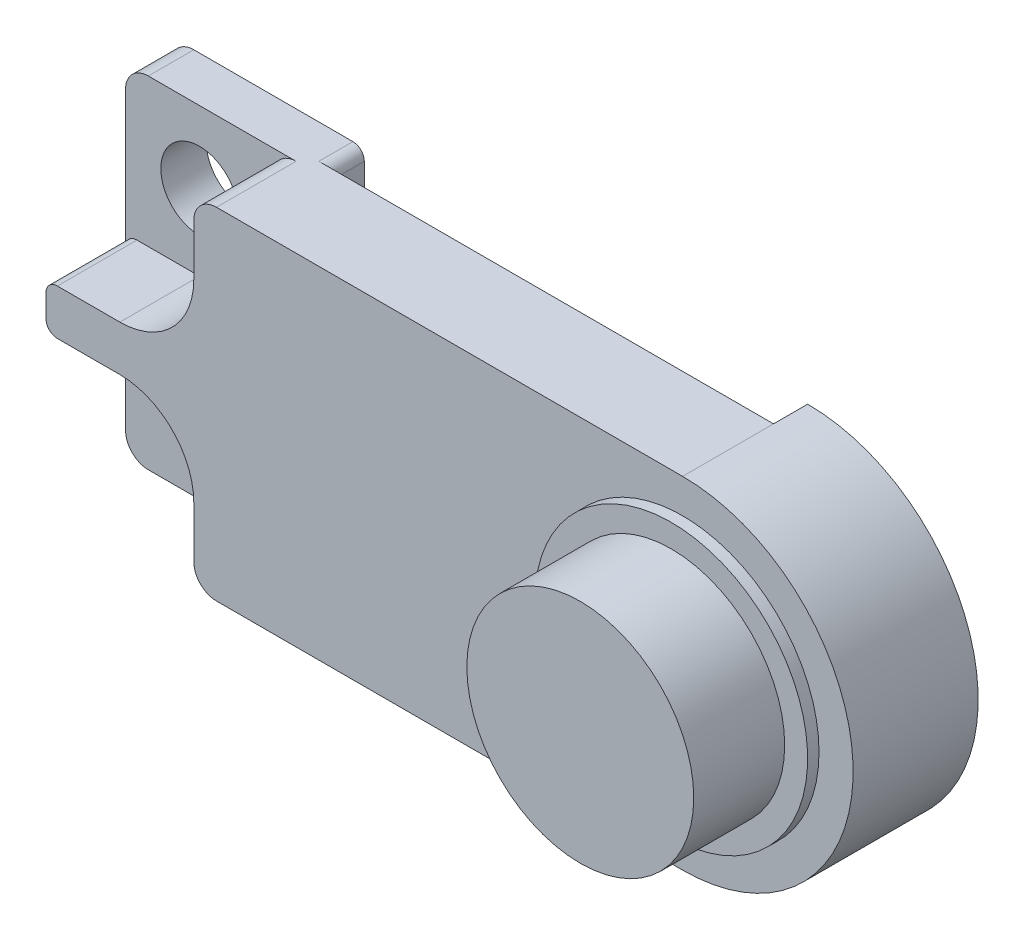
ISO-10303-21;
HEADER;
FILE_DESCRIPTION(('STEP AP214'),'2;1');
FILE_NAME('part.step','',(''),(''),'','','');
FILE_SCHEMA(('AUTOMOTIVE_DESIGN { 1 0 10303 214 1 1 1 1 }'));
ENDSEC;
DATA;
#1=APPLICATION_CONTEXT('core data for automotive mechanical design processes');
#2=APPLICATION_PROTOCOL_DEFINITION('international standard','automotive_design',2000,#1);
#3=PRODUCT_CONTEXT('',#1,'mechanical');
#4=PRODUCT('Part','Part','',(#3));
#5=PRODUCT_RELATED_PRODUCT_CATEGORY('part','',(#4));
#6=PRODUCT_DEFINITION_FORMATION('','',#4);
#7=PRODUCT_DEFINITION_CONTEXT('part definition',#1,'design');
#8=PRODUCT_DEFINITION('design','',#6,#7);
#9=PRODUCT_DEFINITION_SHAPE('','',#8);
#10=(LENGTH_UNIT() NAMED_UNIT(*) SI_UNIT(.MILLI.,.METRE.));
#11=(NAMED_UNIT(*) PLANE_ANGLE_UNIT() SI_UNIT($,.RADIAN.));
#12=(NAMED_UNIT(*) SI_UNIT($,.STERADIAN.) SOLID_ANGLE_UNIT());
#13=UNCERTAINTY_MEASURE_WITH_UNIT(LENGTH_MEASURE(1.E-05),#10,'distance_accuracy_value','');
#14=(GEOMETRIC_REPRESENTATION_CONTEXT(3) GLOBAL_UNCERTAINTY_ASSIGNED_CONTEXT((#13)) GLOBAL_UNIT_ASSIGNED_CONTEXT((#10,
#11,#12)) REPRESENTATION_CONTEXT('',''));
#15=CARTESIAN_POINT('',(0.,0.,0.));
#16=DIRECTION('',(0.,0.,1.));
#17=DIRECTION('',(1.,0.,0.));
#18=AXIS2_PLACEMENT_3D('',#15,#16,#17);
#19=CARTESIAN_POINT('',(19.5,-1.83387272193696,0.));
#20=DIRECTION('',(0.,0.,1.));
#21=DIRECTION('',(1.,0.,0.));
#22=AXIS2_PLACEMENT_3D('',#19,#20,#21);
#23=PLANE('',#22);
#24=CARTESIAN_POINT('',(19.5,-1.83387272193696,0.));
#25=DIRECTION('',(0.,0.,1.));
#26=DIRECTION('',(1.,0.,0.));
#27=AXIS2_PLACEMENT_3D('',#24,#25,#26);
#28=CIRCLE('',#27,7.50000000000001);
#29=CARTESIAN_POINT('',(19.5,-9.33387272193696,0.));
#30=VERTEX_POINT('',#29);
#31=CARTESIAN_POINT('',(19.5,5.66612727806305,0.));
#32=VERTEX_POINT('',#31);
#33=EDGE_CURVE('E231',#30,#32,#28,.T.);
#34=ORIENTED_EDGE('',*,*,#33,.F.);
#35=DIRECTION('',(0.,-1.,0.));
#36=VECTOR('',#35,1.);
#37=CARTESIAN_POINT('',(19.5,5.66612727806305,0.));
#38=LINE('',#37,#36);
#39=EDGE_CURVE('E366',#32,#30,#38,.T.);
#40=ORIENTED_EDGE('',*,*,#39,.F.);
#41=EDGE_LOOP('',(#34,#40));
#42=FACE_BOUND('',#41,.T.);
#43=ADVANCED_FACE('F41',(#42),#23,.F.);
#44=CARTESIAN_POINT('',(19.5,-1.83387272193696,0.));
#45=DIRECTION('',(0.,0.,1.));
#46=DIRECTION('',(1.,0.,0.));
#47=AXIS2_PLACEMENT_3D('',#44,#45,#46);
#48=CYLINDRICAL_SURFACE('',#47,7.50000000000001);
#49=CARTESIAN_POINT('',(19.5,-1.83387272193696,5.5));
#50=DIRECTION('',(0.,0.,1.));
#51=DIRECTION('',(1.,0.,0.));
#52=AXIS2_PLACEMENT_3D('',#49,#50,#51);
#53=CIRCLE('',#52,7.50000000000001);
#54=CARTESIAN_POINT('',(19.5,-9.33387272193696,5.5));
#55=VERTEX_POINT('',#54);
#56=CARTESIAN_POINT('',(19.5,5.66612727806305,5.5));
#57=VERTEX_POINT('',#56);
#58=EDGE_CURVE('E368',#55,#57,#53,.T.);
#59=ORIENTED_EDGE('',*,*,#58,.F.);
#60=DIRECTION('',(0.,0.,1.));
#61=VECTOR('',#60,1.);
#62=CARTESIAN_POINT('',(19.5,-9.33387272193696,0.));
#63=LINE('',#62,#61);
#64=CARTESIAN_POINT('',(19.5,-9.33387272193696,1.5));
#65=VERTEX_POINT('',#64);
#66=EDGE_CURVE('E232',#65,#55,#63,.T.);
#67=ORIENTED_EDGE('',*,*,#66,.F.);
#68=EDGE_CURVE('E201',#30,#65,#63,.T.);
#69=ORIENTED_EDGE('',*,*,#68,.F.);
#70=ORIENTED_EDGE('',*,*,#33,.T.);
#71=DIRECTION('',(0.,0.,1.));
#72=VECTOR('',#71,1.);
#73=CARTESIAN_POINT('',(19.5,5.66612727806305,0.));
#74=LINE('',#73,#72);
#75=CARTESIAN_POINT('',(19.5,5.66612727806305,1.5));
#76=VERTEX_POINT('',#75);
#77=EDGE_CURVE('E198',#32,#76,#74,.T.);
#78=ORIENTED_EDGE('',*,*,#77,.T.);
#79=EDGE_CURVE('E219',#76,#57,#74,.T.);
#80=ORIENTED_EDGE('',*,*,#79,.T.);
#81=EDGE_LOOP('',(#59,#67,#69,#70,#78,#80));
#82=FACE_BOUND('',#81,.T.);
#83=ADVANCED_FACE('F229',(#82),#48,.T.);
#84=CARTESIAN_POINT('',(-8.5,-9.33387272193696,0.));
#85=DIRECTION('',(0.,-1.,0.));
#86=DIRECTION('',(0.,0.,-1.));
#87=AXIS2_PLACEMENT_3D('',#84,#85,#86);
#88=PLANE('',#87);
#89=DIRECTION('',(-1.,0.,0.));
#90=VECTOR('',#89,1.);
#91=CARTESIAN_POINT('',(-2.,-9.33387272193696,2.));
#92=LINE('',#91,#90);
#93=CARTESIAN_POINT('',(-1.,-9.33387272193696,2.));
#94=VERTEX_POINT('',#93);
#95=CARTESIAN_POINT('',(-7.5,-9.33387272193696,2.));
#96=VERTEX_POINT('',#95);
#97=EDGE_CURVE('E447',#94,#96,#92,.T.);
#98=ORIENTED_EDGE('',*,*,#97,.T.);
#99=DIRECTION('',(0.,0.,1.));
#100=VECTOR('',#99,1.);
#101=CARTESIAN_POINT('',(-7.5,-9.33387272193696,0.));
#102=LINE('',#101,#100);
#103=CARTESIAN_POINT('',(-7.5,-9.33387272193696,0.));
#104=VERTEX_POINT('',#103);
#105=EDGE_CURVE('E290',#96,#104,#102,.F.);
#106=ORIENTED_EDGE('',*,*,#105,.T.);
#107=DIRECTION('',(1.,0.,0.));
#108=VECTOR('',#107,1.);
#109=CARTESIAN_POINT('',(-8.5,-9.33387272193696,0.));
#110=LINE('',#109,#108);
#111=CARTESIAN_POINT('',(-0.499999999999999,-9.33387272193696,0.));
#112=VERTEX_POINT('',#111);
#113=EDGE_CURVE('E226',#104,#112,#110,.T.);
#114=ORIENTED_EDGE('',*,*,#113,.T.);
#115=DIRECTION('',(0.,0.,-1.));
#116=VECTOR('',#115,1.);
#117=CARTESIAN_POINT('',(-0.499999999999999,-9.33387272193696,1.5));
#118=LINE('',#117,#116);
#119=CARTESIAN_POINT('',(-0.499999999999997,-9.33387272193696,1.5));
#120=VERTEX_POINT('',#119);
#121=EDGE_CURVE('E268',#112,#120,#118,.F.);
#122=ORIENTED_EDGE('',*,*,#121,.T.);
#123=DIRECTION('',(-1.,0.,0.));
#124=VECTOR('',#123,1.);
#125=CARTESIAN_POINT('',(19.5,-9.33387272193696,1.5));
#126=LINE('',#125,#124);
#127=EDGE_CURVE('E216',#65,#120,#126,.T.);
#128=ORIENTED_EDGE('',*,*,#127,.F.);
#129=ORIENTED_EDGE('',*,*,#66,.T.);
#130=DIRECTION('',(1.,0.,0.));
#131=VECTOR('',#130,1.);
#132=CARTESIAN_POINT('',(-8.5,-9.33387272193696,5.5));
#133=LINE('',#132,#131);
#134=CARTESIAN_POINT('',(-0.999999999999999,-9.33387272193696,5.5));
#135=VERTEX_POINT('',#134);
#136=EDGE_CURVE('E376',#135,#55,#133,.T.);
#137=ORIENTED_EDGE('',*,*,#136,.F.);
#138=DIRECTION('',(0.,0.,1.));
#139=VECTOR('',#138,1.);
#140=CARTESIAN_POINT('',(-0.999999999999999,-9.33387272193696,0.));
#141=LINE('',#140,#139);
#142=EDGE_CURVE('E287',#135,#94,#141,.F.);
#143=ORIENTED_EDGE('',*,*,#142,.T.);
#144=EDGE_LOOP('',(#98,#106,#114,#122,#128,#129,#137,#143));
#145=FACE_BOUND('',#144,.T.);
#146=ADVANCED_FACE('F393',(#145),#88,.T.);
#147=CARTESIAN_POINT('',(-8.5,5.66612727806304,0.));
#148=DIRECTION('',(-1.,0.,0.));
#149=DIRECTION('',(0.,-1.,0.));
#150=AXIS2_PLACEMENT_3D('',#147,#148,#149);
#151=PLANE('',#150);
#152=DIRECTION('',(0.,-1.,0.));
#153=VECTOR('',#152,1.);
#154=CARTESIAN_POINT('',(-8.5,5.66612727806304,0.));
#155=LINE('',#154,#153);
#156=CARTESIAN_POINT('',(-8.5,4.66612727806304,0.));
#157=VERTEX_POINT('',#156);
#158=CARTESIAN_POINT('',(-8.5,-8.33387272193696,0.));
#159=VERTEX_POINT('',#158);
#160=EDGE_CURVE('E379',#157,#159,#155,.T.);
#161=ORIENTED_EDGE('',*,*,#160,.T.);
#162=DIRECTION('',(0.,0.,1.));
#163=VECTOR('',#162,1.);
#164=CARTESIAN_POINT('',(-8.5,-8.33387272193696,0.));
#165=LINE('',#164,#163);
#166=CARTESIAN_POINT('',(-8.5,-8.33387272193696,2.));
#167=VERTEX_POINT('',#166);
#168=EDGE_CURVE('E282',#159,#167,#165,.T.);
#169=ORIENTED_EDGE('',*,*,#168,.T.);
#170=DIRECTION('',(0.,-1.,0.));
#171=VECTOR('',#170,1.);
#172=CARTESIAN_POINT('',(-8.5,-2.83387272193696,2.));
#173=LINE('',#172,#171);
#174=CARTESIAN_POINT('',(-8.5,-2.33387272193696,2.));
#175=VERTEX_POINT('',#174);
#176=EDGE_CURVE('E432',#175,#167,#173,.T.);
#177=ORIENTED_EDGE('',*,*,#176,.F.);
#178=DIRECTION('',(0.,0.,-1.));
#179=VECTOR('',#178,1.);
#180=CARTESIAN_POINT('',(-8.5,-2.33387272193696,5.5));
#181=LINE('',#180,#179);
#182=CARTESIAN_POINT('',(-8.5,-2.33387272193696,5.5));
#183=VERTEX_POINT('',#182);
#184=EDGE_CURVE('E248',#175,#183,#181,.F.);
#185=ORIENTED_EDGE('',*,*,#184,.T.);
#186=DIRECTION('',(0.,-1.,0.));
#187=VECTOR('',#186,1.);
#188=CARTESIAN_POINT('',(-8.5,5.66612727806304,5.5));
#189=LINE('',#188,#187);
#190=CARTESIAN_POINT('',(-8.5,-1.33387272193696,5.5));
#191=VERTEX_POINT('',#190);
#192=EDGE_CURVE('E385',#191,#183,#189,.T.);
#193=ORIENTED_EDGE('',*,*,#192,.F.);
#194=DIRECTION('',(0.,0.,1.));
#195=VECTOR('',#194,1.);
#196=CARTESIAN_POINT('',(-8.5,-1.33387272193696,0.));
#197=LINE('',#196,#195);
#198=CARTESIAN_POINT('',(-8.5,-1.33387272193696,2.));
#199=VERTEX_POINT('',#198);
#200=EDGE_CURVE('E250',#191,#199,#197,.F.);
#201=ORIENTED_EDGE('',*,*,#200,.T.);
#202=DIRECTION('',(0.,1.,0.));
#203=VECTOR('',#202,1.);
#204=CARTESIAN_POINT('',(-8.5,-0.833872721936957,2.));
#205=LINE('',#204,#203);
#206=CARTESIAN_POINT('',(-8.5,4.66612727806304,2.));
#207=VERTEX_POINT('',#206);
#208=EDGE_CURVE('E358',#199,#207,#205,.T.);
#209=ORIENTED_EDGE('',*,*,#208,.T.);
#210=DIRECTION('',(0.,0.,1.));
#211=VECTOR('',#210,1.);
#212=CARTESIAN_POINT('',(-8.5,4.66612727806304,0.));
#213=LINE('',#212,#211);
#214=EDGE_CURVE('E280',#207,#157,#213,.F.);
#215=ORIENTED_EDGE('',*,*,#214,.T.);
#216=EDGE_LOOP('',(#161,#169,#177,#185,#193,#201,#209,#215));
#217=FACE_BOUND('',#216,.T.);
#218=ADVANCED_FACE('F412',(#217),#151,.T.);
#219=CARTESIAN_POINT('',(19.5,5.66612727806305,0.));
#220=DIRECTION('',(0.,1.,0.));
#221=DIRECTION('',(-1.,0.,0.));
#222=AXIS2_PLACEMENT_3D('',#219,#220,#221);
#223=PLANE('',#222);
#224=DIRECTION('',(-1.,0.,0.));
#225=VECTOR('',#224,1.);
#226=CARTESIAN_POINT('',(-2.,5.66612727806304,2.));
#227=LINE('',#226,#225);
#228=CARTESIAN_POINT('',(-1.,5.66612727806304,2.));
#229=VERTEX_POINT('',#228);
#230=CARTESIAN_POINT('',(-7.5,5.66612727806304,2.));
#231=VERTEX_POINT('',#230);
#232=EDGE_CURVE('E347',#229,#231,#227,.T.);
#233=ORIENTED_EDGE('',*,*,#232,.F.);
#234=DIRECTION('',(0.,0.,-1.));
#235=VECTOR('',#234,1.);
#236=CARTESIAN_POINT('',(-0.999999999999999,5.66612727806304,5.5));
#237=LINE('',#236,#235);
#238=CARTESIAN_POINT('',(-0.999999999999997,5.66612727806304,5.5));
#239=VERTEX_POINT('',#238);
#240=EDGE_CURVE('E302',#229,#239,#237,.F.);
#241=ORIENTED_EDGE('',*,*,#240,.T.);
#242=DIRECTION('',(-1.,0.,0.));
#243=VECTOR('',#242,1.);
#244=CARTESIAN_POINT('',(19.5,5.66612727806305,5.5));
#245=LINE('',#244,#243);
#246=EDGE_CURVE('E222',#57,#239,#245,.T.);
#247=ORIENTED_EDGE('',*,*,#246,.F.);
#248=ORIENTED_EDGE('',*,*,#79,.F.);
#249=DIRECTION('',(-1.,0.,0.));
#250=VECTOR('',#249,1.);
#251=CARTESIAN_POINT('',(19.5,5.66612727806305,1.5));
#252=LINE('',#251,#250);
#253=CARTESIAN_POINT('',(-0.499999999999997,5.66612727806305,1.5));
#254=VERTEX_POINT('',#253);
#255=EDGE_CURVE('E205',#76,#254,#252,.T.);
#256=ORIENTED_EDGE('',*,*,#255,.T.);
#257=DIRECTION('',(0.,0.,-1.));
#258=VECTOR('',#257,1.);
#259=CARTESIAN_POINT('',(-0.499999999999997,5.66612727806304,0.));
#260=LINE('',#259,#258);
#261=CARTESIAN_POINT('',(-0.499999999999997,5.66612727806304,0.));
#262=VERTEX_POINT('',#261);
#263=EDGE_CURVE('E253',#254,#262,#260,.T.);
#264=ORIENTED_EDGE('',*,*,#263,.T.);
#265=DIRECTION('',(-1.,0.,0.));
#266=VECTOR('',#265,1.);
#267=CARTESIAN_POINT('',(19.5,5.66612727806305,0.));
#268=LINE('',#267,#266);
#269=CARTESIAN_POINT('',(-7.5,5.66612727806304,0.));
#270=VERTEX_POINT('',#269);
#271=EDGE_CURVE('E375',#262,#270,#268,.T.);
#272=ORIENTED_EDGE('',*,*,#271,.T.);
#273=DIRECTION('',(0.,0.,1.));
#274=VECTOR('',#273,1.);
#275=CARTESIAN_POINT('',(-7.5,5.66612727806304,0.));
#276=LINE('',#275,#274);
#277=EDGE_CURVE('E299',#270,#231,#276,.T.);
#278=ORIENTED_EDGE('',*,*,#277,.T.);
#279=EDGE_LOOP('',(#233,#241,#247,#248,#256,#264,#272,#278));
#280=FACE_BOUND('',#279,.T.);
#281=ADVANCED_FACE('F220',(#280),#223,.T.);
#282=CARTESIAN_POINT('',(-5.25,2.41612727806304,0.));
#283=DIRECTION('',(0.,0.,1.));
#284=DIRECTION('',(1.,0.,0.));
#285=AXIS2_PLACEMENT_3D('',#282,#283,#284);
#286=CIRCLE('',#285,1.69999999999999);
#287=CARTESIAN_POINT('',(-3.55000000000001,2.41612727806304,0.));
#288=VERTEX_POINT('',#287);
#289=EDGE_CURVE('E417',#288,#288,#286,.T.);
#290=ORIENTED_EDGE('',*,*,#289,.T.);
#291=EDGE_LOOP('',(#290));
#292=FACE_BOUND('',#291,.T.);
#293=CARTESIAN_POINT('',(-5.25,-6.08387272193696,0.));
#294=DIRECTION('',(0.,0.,1.));
#295=DIRECTION('',(1.,0.,0.));
#296=AXIS2_PLACEMENT_3D('',#293,#294,#295);
#297=CIRCLE('',#296,1.69999999999999);
#298=CARTESIAN_POINT('',(-3.55000000000001,-6.08387272193696,0.));
#299=VERTEX_POINT('',#298);
#300=EDGE_CURVE('E421',#299,#299,#297,.T.);
#301=ORIENTED_EDGE('',*,*,#300,.T.);
#302=EDGE_LOOP('',(#301));
#303=FACE_BOUND('',#302,.T.);
#304=ORIENTED_EDGE('',*,*,#113,.F.);
#305=CARTESIAN_POINT('',(-7.5,-8.33387272193696,0.));
#306=DIRECTION('',(0.,0.,1.));
#307=DIRECTION('',(1.,0.,0.));
#308=AXIS2_PLACEMENT_3D('',#305,#306,#307);
#309=CIRCLE('',#308,1.);
#310=EDGE_CURVE('E294',#104,#159,#309,.F.);
#311=ORIENTED_EDGE('',*,*,#310,.T.);
#312=ORIENTED_EDGE('',*,*,#160,.F.);
#313=CARTESIAN_POINT('',(-7.5,4.66612727806304,0.));
#314=DIRECTION('',(0.,0.,1.));
#315=DIRECTION('',(1.,0.,0.));
#316=AXIS2_PLACEMENT_3D('',#313,#314,#315);
#317=CIRCLE('',#316,1.);
#318=EDGE_CURVE('E292',#157,#270,#317,.F.);
#319=ORIENTED_EDGE('',*,*,#318,.T.);
#320=ORIENTED_EDGE('',*,*,#271,.F.);
#321=CARTESIAN_POINT('',(-0.499999999999997,5.16612727806304,0.));
#322=DIRECTION('',(0.,0.,1.));
#323=DIRECTION('',(1.,0.,0.));
#324=AXIS2_PLACEMENT_3D('',#321,#322,#323);
#325=CIRCLE('',#324,0.5);
#326=CARTESIAN_POINT('',(0.,5.16612727806304,0.));
#327=VERTEX_POINT('',#326);
#328=EDGE_CURVE('E258',#262,#327,#325,.F.);
#329=ORIENTED_EDGE('',*,*,#328,.T.);
#330=DIRECTION('',(0.,-1.,0.));
#331=VECTOR('',#330,1.);
#332=CARTESIAN_POINT('',(0.,5.66612727806305,0.));
#333=LINE('',#332,#331);
#334=CARTESIAN_POINT('',(0.,-8.83387272193696,0.));
#335=VERTEX_POINT('',#334);
#336=EDGE_CURVE('E369',#327,#335,#333,.T.);
#337=ORIENTED_EDGE('',*,*,#336,.T.);
#338=CARTESIAN_POINT('',(-0.499999999999999,-8.83387272193696,0.));
#339=DIRECTION('',(0.,0.,1.));
#340=DIRECTION('',(1.,0.,0.));
#341=AXIS2_PLACEMENT_3D('',#338,#339,#340);
#342=CIRCLE('',#341,0.5);
#343=EDGE_CURVE('E255',#335,#112,#342,.F.);
#344=ORIENTED_EDGE('',*,*,#343,.T.);
#345=EDGE_LOOP('',(#304,#311,#312,#319,#320,#329,#337,#344));
#346=FACE_BOUND('',#345,.T.);
#347=ADVANCED_FACE('F397',(#292,#303,#346),#23,.F.);
#348=CARTESIAN_POINT('',(19.5,-1.83387272193696,5.5));
#349=DIRECTION('',(0.,0.,1.));
#350=DIRECTION('',(1.,0.,0.));
#351=AXIS2_PLACEMENT_3D('',#348,#349,#350);
#352=PLANE('',#351);
#353=CARTESIAN_POINT('',(19.5,-1.83387272193696,5.5));
#354=DIRECTION('',(0.,0.,1.));
#355=DIRECTION('',(1.,0.,0.));
#356=AXIS2_PLACEMENT_3D('',#353,#354,#355);
#357=CIRCLE('',#356,6.);
#358=CARTESIAN_POINT('',(25.5,-1.83387272193696,5.5));
#359=VERTEX_POINT('',#358);
#360=EDGE_CURVE('E237',#359,#359,#357,.T.);
#361=ORIENTED_EDGE('',*,*,#360,.F.);
#362=EDGE_LOOP('',(#361));
#363=FACE_BOUND('',#362,.T.);
#364=ORIENTED_EDGE('',*,*,#246,.T.);
#365=CARTESIAN_POINT('',(-0.999999999999999,4.66612727806304,5.5));
#366=DIRECTION('',(0.,0.,1.));
#367=DIRECTION('',(1.,0.,0.));
#368=AXIS2_PLACEMENT_3D('',#365,#366,#367);
#369=CIRCLE('',#368,1.);
#370=CARTESIAN_POINT('',(-2.,4.66612727806304,5.5));
#371=VERTEX_POINT('',#370);
#372=EDGE_CURVE('E306',#239,#371,#369,.T.);
#373=ORIENTED_EDGE('',*,*,#372,.T.);
#374=DIRECTION('',(0.,1.,0.));
#375=VECTOR('',#374,1.);
#376=CARTESIAN_POINT('',(-2.,-0.833872721936954,5.5));
#377=LINE('',#376,#375);
#378=CARTESIAN_POINT('',(-2.,2.41612727806305,5.5));
#379=VERTEX_POINT('',#378);
#380=EDGE_CURVE('E338',#379,#371,#377,.T.);
#381=ORIENTED_EDGE('',*,*,#380,.F.);
#382=CARTESIAN_POINT('',(-5.25,2.41612727806304,5.5));
#383=DIRECTION('',(0.,0.,1.));
#384=DIRECTION('',(1.,0.,0.));
#385=AXIS2_PLACEMENT_3D('',#382,#383,#384);
#386=CIRCLE('',#385,3.25);
#387=CARTESIAN_POINT('',(-5.25,-0.833872721936955,5.5));
#388=VERTEX_POINT('',#387);
#389=EDGE_CURVE('E49',#379,#388,#386,.F.);
#390=ORIENTED_EDGE('',*,*,#389,.T.);
#391=DIRECTION('',(1.,0.,0.));
#392=VECTOR('',#391,1.);
#393=CARTESIAN_POINT('',(-8.5,-0.833872721936957,5.5));
#394=LINE('',#393,#392);
#395=CARTESIAN_POINT('',(-8.,-0.833872721936956,5.5));
#396=VERTEX_POINT('',#395);
#397=EDGE_CURVE('E337',#396,#388,#394,.T.);
#398=ORIENTED_EDGE('',*,*,#397,.F.);
#399=CARTESIAN_POINT('',(-8.,-1.33387272193696,5.5));
#400=DIRECTION('',(0.,0.,1.));
#401=DIRECTION('',(1.,0.,0.));
#402=AXIS2_PLACEMENT_3D('',#399,#400,#401);
#403=CIRCLE('',#402,0.5);
#404=EDGE_CURVE('E246',#396,#191,#403,.T.);
#405=ORIENTED_EDGE('',*,*,#404,.T.);
#406=ORIENTED_EDGE('',*,*,#192,.T.);
#407=CARTESIAN_POINT('',(-8.,-2.33387272193696,5.5));
#408=DIRECTION('',(0.,0.,1.));
#409=DIRECTION('',(1.,0.,0.));
#410=AXIS2_PLACEMENT_3D('',#407,#408,#409);
#411=CIRCLE('',#410,0.5);
#412=CARTESIAN_POINT('',(-8.,-2.83387272193696,5.5));
#413=VERTEX_POINT('',#412);
#414=EDGE_CURVE('E243',#183,#413,#411,.T.);
#415=ORIENTED_EDGE('',*,*,#414,.T.);
#416=DIRECTION('',(-1.,0.,0.));
#417=VECTOR('',#416,1.);
#418=CARTESIAN_POINT('',(-2.,-2.83387272193696,5.5));
#419=LINE('',#418,#417);
#420=CARTESIAN_POINT('',(-5.25,-2.83387272193696,5.5));
#421=VERTEX_POINT('',#420);
#422=EDGE_CURVE('E451',#421,#413,#419,.T.);
#423=ORIENTED_EDGE('',*,*,#422,.F.);
#424=CARTESIAN_POINT('',(-5.25,-6.08387272193696,5.5));
#425=DIRECTION('',(0.,0.,1.));
#426=DIRECTION('',(1.,0.,0.));
#427=AXIS2_PLACEMENT_3D('',#424,#425,#426);
#428=CIRCLE('',#427,3.25);
#429=CARTESIAN_POINT('',(-2.,-6.08387272193696,5.5));
#430=VERTEX_POINT('',#429);
#431=EDGE_CURVE('E11',#421,#430,#428,.F.);
#432=ORIENTED_EDGE('',*,*,#431,.T.);
#433=DIRECTION('',(0.,1.,0.));
#434=VECTOR('',#433,1.);
#435=CARTESIAN_POINT('',(-2.,-9.33387272193696,5.5));
#436=LINE('',#435,#434);
#437=CARTESIAN_POINT('',(-2.,-8.33387272193696,5.5));
#438=VERTEX_POINT('',#437);
#439=EDGE_CURVE('E436',#438,#430,#436,.T.);
#440=ORIENTED_EDGE('',*,*,#439,.F.);
#441=CARTESIAN_POINT('',(-1.,-8.33387272193696,5.5));
#442=DIRECTION('',(0.,0.,1.));
#443=DIRECTION('',(1.,0.,0.));
#444=AXIS2_PLACEMENT_3D('',#441,#442,#443);
#445=CIRCLE('',#444,1.);
#446=EDGE_CURVE('E304',#438,#135,#445,.T.);
#447=ORIENTED_EDGE('',*,*,#446,.T.);
#448=ORIENTED_EDGE('',*,*,#136,.T.);
#449=ORIENTED_EDGE('',*,*,#58,.T.);
#450=EDGE_LOOP('',(#364,#373,#381,#390,#398,#405,#406,#415,#423,#432,#440,#447,#448,#449));
#451=FACE_BOUND('',#450,.T.);
#452=ADVANCED_FACE('F336',(#363,#451),#352,.T.);
#453=CARTESIAN_POINT('',(19.5,5.66612727806305,0.));
#454=DIRECTION('',(1.,0.,0.));
#455=DIRECTION('',(0.,0.,-1.));
#456=AXIS2_PLACEMENT_3D('',#453,#454,#455);
#457=PLANE('',#456);
#458=ORIENTED_EDGE('',*,*,#68,.T.);
#459=DIRECTION('',(0.,-1.,0.));
#460=VECTOR('',#459,1.);
#461=CARTESIAN_POINT('',(19.5,5.66612727806305,1.5));
#462=LINE('',#461,#460);
#463=EDGE_CURVE('E194',#76,#65,#462,.T.);
#464=ORIENTED_EDGE('',*,*,#463,.F.);
#465=ORIENTED_EDGE('',*,*,#77,.F.);
#466=ORIENTED_EDGE('',*,*,#39,.T.);
#467=EDGE_LOOP('',(#458,#464,#465,#466));
#468=FACE_BOUND('',#467,.T.);
#469=ADVANCED_FACE('F196',(#468),#457,.F.);
#470=CARTESIAN_POINT('',(0.,5.66612727806305,1.5));
#471=DIRECTION('',(-1.,0.,0.));
#472=DIRECTION('',(0.,0.,1.));
#473=AXIS2_PLACEMENT_3D('',#470,#471,#472);
#474=PLANE('',#473);
#475=ORIENTED_EDGE('',*,*,#336,.F.);
#476=DIRECTION('',(0.,0.,-1.));
#477=VECTOR('',#476,1.);
#478=CARTESIAN_POINT('',(0.,5.16612727806304,1.5));
#479=LINE('',#478,#477);
#480=CARTESIAN_POINT('',(0.,5.16612727806304,1.5));
#481=VERTEX_POINT('',#480);
#482=EDGE_CURVE('E263',#327,#481,#479,.F.);
#483=ORIENTED_EDGE('',*,*,#482,.T.);
#484=DIRECTION('',(0.,-1.,0.));
#485=VECTOR('',#484,1.);
#486=CARTESIAN_POINT('',(0.,5.66612727806305,1.5));
#487=LINE('',#486,#485);
#488=CARTESIAN_POINT('',(0.,-8.83387272193696,1.5));
#489=VERTEX_POINT('',#488);
#490=EDGE_CURVE('E204',#481,#489,#487,.T.);
#491=ORIENTED_EDGE('',*,*,#490,.T.);
#492=DIRECTION('',(0.,0.,-1.));
#493=VECTOR('',#492,1.);
#494=CARTESIAN_POINT('',(0.,-8.83387272193696,0.));
#495=LINE('',#494,#493);
#496=EDGE_CURVE('E260',#489,#335,#495,.T.);
#497=ORIENTED_EDGE('',*,*,#496,.T.);
#498=EDGE_LOOP('',(#475,#483,#491,#497));
#499=FACE_BOUND('',#498,.T.);
#500=ADVANCED_FACE('F465',(#499),#474,.F.);
#501=CARTESIAN_POINT('',(19.5,5.66612727806305,1.5));
#502=DIRECTION('',(0.,0.,1.));
#503=DIRECTION('',(1.,0.,0.));
#504=AXIS2_PLACEMENT_3D('',#501,#502,#503);
#505=PLANE('',#504);
#506=ORIENTED_EDGE('',*,*,#127,.T.);
#507=CARTESIAN_POINT('',(-0.499999999999999,-8.83387272193696,1.5));
#508=DIRECTION('',(0.,0.,1.));
#509=DIRECTION('',(1.,0.,0.));
#510=AXIS2_PLACEMENT_3D('',#507,#508,#509);
#511=CIRCLE('',#510,0.5);
#512=EDGE_CURVE('E278',#120,#489,#511,.T.);
#513=ORIENTED_EDGE('',*,*,#512,.T.);
#514=ORIENTED_EDGE('',*,*,#490,.F.);
#515=CARTESIAN_POINT('',(-0.499999999999996,5.16612727806304,1.5));
#516=DIRECTION('',(0.,0.,1.));
#517=DIRECTION('',(1.,0.,0.));
#518=AXIS2_PLACEMENT_3D('',#515,#516,#517);
#519=CIRCLE('',#518,0.5);
#520=EDGE_CURVE('E212',#481,#254,#519,.T.);
#521=ORIENTED_EDGE('',*,*,#520,.T.);
#522=ORIENTED_EDGE('',*,*,#255,.F.);
#523=ORIENTED_EDGE('',*,*,#463,.T.);
#524=EDGE_LOOP('',(#506,#513,#514,#521,#522,#523));
#525=FACE_BOUND('',#524,.T.);
#526=ADVANCED_FACE('F209',(#525),#505,.F.);
#527=CARTESIAN_POINT('',(-2.,-0.833872721936954,2.));
#528=DIRECTION('',(0.,0.,-1.));
#529=DIRECTION('',(-1.,0.,0.));
#530=AXIS2_PLACEMENT_3D('',#527,#528,#529);
#531=PLANE('',#530);
#532=CARTESIAN_POINT('',(-5.25,2.41612727806304,2.));
#533=DIRECTION('',(0.,0.,1.));
#534=DIRECTION('',(1.,0.,0.));
#535=AXIS2_PLACEMENT_3D('',#532,#533,#534);
#536=CIRCLE('',#535,1.69999999999999);
#537=CARTESIAN_POINT('',(-3.55000000000001,2.41612727806304,2.));
#538=VERTEX_POINT('',#537);
#539=EDGE_CURVE('E741',#538,#538,#536,.T.);
#540=ORIENTED_EDGE('',*,*,#539,.F.);
#541=EDGE_LOOP('',(#540));
#542=FACE_BOUND('',#541,.T.);
#543=DIRECTION('',(-1.,0.,0.));
#544=VECTOR('',#543,1.);
#545=CARTESIAN_POINT('',(-2.,-0.833872721936954,2.));
#546=LINE('',#545,#544);
#547=CARTESIAN_POINT('',(-5.25,-0.833872721936955,2.));
#548=VERTEX_POINT('',#547);
#549=CARTESIAN_POINT('',(-8.,-0.833872721936956,2.));
#550=VERTEX_POINT('',#549);
#551=EDGE_CURVE('E346',#548,#550,#546,.T.);
#552=ORIENTED_EDGE('',*,*,#551,.F.);
#553=CARTESIAN_POINT('',(-5.25,2.41612727806304,2.));
#554=DIRECTION('',(0.,0.,-1.));
#555=DIRECTION('',(-1.,0.,0.));
#556=AXIS2_PLACEMENT_3D('',#553,#554,#555);
#557=CIRCLE('',#556,3.25);
#558=CARTESIAN_POINT('',(-2.,2.41612727806305,2.));
#559=VERTEX_POINT('',#558);
#560=EDGE_CURVE('E323',#548,#559,#557,.F.);
#561=ORIENTED_EDGE('',*,*,#560,.T.);
#562=DIRECTION('',(0.,1.,0.));
#563=VECTOR('',#562,1.);
#564=CARTESIAN_POINT('',(-2.,-0.833872721936954,2.));
#565=LINE('',#564,#563);
#566=CARTESIAN_POINT('',(-2.,4.66612727806304,2.));
#567=VERTEX_POINT('',#566);
#568=EDGE_CURVE('E353',#559,#567,#565,.T.);
#569=ORIENTED_EDGE('',*,*,#568,.T.);
#570=CARTESIAN_POINT('',(-0.999999999999999,4.66612727806304,2.));
#571=DIRECTION('',(0.,0.,-1.));
#572=DIRECTION('',(-1.,0.,0.));
#573=AXIS2_PLACEMENT_3D('',#570,#571,#572);
#574=CIRCLE('',#573,1.);
#575=EDGE_CURVE('E314',#567,#229,#574,.T.);
#576=ORIENTED_EDGE('',*,*,#575,.T.);
#577=ORIENTED_EDGE('',*,*,#232,.T.);
#578=CARTESIAN_POINT('',(-7.5,4.66612727806304,2.));
#579=DIRECTION('',(0.,0.,-1.));
#580=DIRECTION('',(-1.,0.,0.));
#581=AXIS2_PLACEMENT_3D('',#578,#579,#580);
#582=CIRCLE('',#581,1.);
#583=EDGE_CURVE('E309',#231,#207,#582,.F.);
#584=ORIENTED_EDGE('',*,*,#583,.T.);
#585=ORIENTED_EDGE('',*,*,#208,.F.);
#586=CARTESIAN_POINT('',(-8.,-1.33387272193696,2.));
#587=DIRECTION('',(0.,0.,-1.));
#588=DIRECTION('',(-1.,0.,0.));
#589=AXIS2_PLACEMENT_3D('',#586,#587,#588);
#590=CIRCLE('',#589,0.5);
#591=EDGE_CURVE('E271',#199,#550,#590,.T.);
#592=ORIENTED_EDGE('',*,*,#591,.T.);
#593=EDGE_LOOP('',(#552,#561,#569,#576,#577,#584,#585,#592));
#594=FACE_BOUND('',#593,.T.);
#595=ADVANCED_FACE('F352',(#542,#594),#531,.F.);
#596=CARTESIAN_POINT('',(-2.,-0.833872721936954,5.5));
#597=DIRECTION('',(1.,0.,0.));
#598=DIRECTION('',(0.,1.,0.));
#599=AXIS2_PLACEMENT_3D('',#596,#597,#598);
#600=PLANE('',#599);
#601=ORIENTED_EDGE('',*,*,#568,.F.);
#602=DIRECTION('',(0.,0.,-1.));
#603=VECTOR('',#602,1.);
#604=CARTESIAN_POINT('',(-2.,2.41612727806305,5.5));
#605=LINE('',#604,#603);
#606=EDGE_CURVE('E325',#559,#379,#605,.F.);
#607=ORIENTED_EDGE('',*,*,#606,.T.);
#608=ORIENTED_EDGE('',*,*,#380,.T.);
#609=DIRECTION('',(0.,0.,-1.));
#610=VECTOR('',#609,1.);
#611=CARTESIAN_POINT('',(-2.,4.66612727806304,2.));
#612=LINE('',#611,#610);
#613=EDGE_CURVE('E296',#371,#567,#612,.T.);
#614=ORIENTED_EDGE('',*,*,#613,.T.);
#615=EDGE_LOOP('',(#601,#607,#608,#614));
#616=FACE_BOUND('',#615,.T.);
#617=ADVANCED_FACE('F356',(#616),#600,.F.);
#618=CARTESIAN_POINT('',(0.,-0.833872721936953,0.));
#619=DIRECTION('',(0.,1.,0.));
#620=DIRECTION('',(-1.,0.,0.));
#621=AXIS2_PLACEMENT_3D('',#618,#619,#620);
#622=PLANE('',#621);
#623=ORIENTED_EDGE('',*,*,#397,.T.);
#624=DIRECTION('',(0.,0.,-1.));
#625=VECTOR('',#624,1.);
#626=CARTESIAN_POINT('',(-5.25,-0.833872721936955,0.));
#627=LINE('',#626,#625);
#628=EDGE_CURVE('E320',#388,#548,#627,.T.);
#629=ORIENTED_EDGE('',*,*,#628,.T.);
#630=ORIENTED_EDGE('',*,*,#551,.T.);
#631=DIRECTION('',(0.,0.,1.));
#632=VECTOR('',#631,1.);
#633=CARTESIAN_POINT('',(-8.,-0.833872721936956,0.));
#634=LINE('',#633,#632);
#635=EDGE_CURVE('E240',#550,#396,#634,.T.);
#636=ORIENTED_EDGE('',*,*,#635,.T.);
#637=EDGE_LOOP('',(#623,#629,#630,#636));
#638=FACE_BOUND('',#637,.T.);
#639=ADVANCED_FACE('F343',(#638),#622,.T.);
#640=CARTESIAN_POINT('',(-2.,-2.83387272193696,2.));
#641=DIRECTION('',(0.,0.,-1.));
#642=DIRECTION('',(-1.,0.,0.));
#643=AXIS2_PLACEMENT_3D('',#640,#641,#642);
#644=PLANE('',#643);
#645=CARTESIAN_POINT('',(-5.25,-6.08387272193696,2.));
#646=DIRECTION('',(0.,0.,1.));
#647=DIRECTION('',(1.,0.,0.));
#648=AXIS2_PLACEMENT_3D('',#645,#646,#647);
#649=CIRCLE('',#648,1.69999999999999);
#650=CARTESIAN_POINT('',(-3.55000000000001,-6.08387272193696,2.));
#651=VERTEX_POINT('',#650);
#652=EDGE_CURVE('E743',#651,#651,#649,.T.);
#653=ORIENTED_EDGE('',*,*,#652,.F.);
#654=EDGE_LOOP('',(#653));
#655=FACE_BOUND('',#654,.T.);
#656=DIRECTION('',(0.,-1.,0.));
#657=VECTOR('',#656,1.);
#658=CARTESIAN_POINT('',(-2.,-2.83387272193696,2.));
#659=LINE('',#658,#657);
#660=CARTESIAN_POINT('',(-2.,-6.08387272193696,2.));
#661=VERTEX_POINT('',#660);
#662=CARTESIAN_POINT('',(-2.,-8.33387272193696,2.));
#663=VERTEX_POINT('',#662);
#664=EDGE_CURVE('E440',#661,#663,#659,.T.);
#665=ORIENTED_EDGE('',*,*,#664,.F.);
#666=CARTESIAN_POINT('',(-5.25,-6.08387272193696,2.));
#667=DIRECTION('',(0.,0.,-1.));
#668=DIRECTION('',(-1.,0.,0.));
#669=AXIS2_PLACEMENT_3D('',#666,#667,#668);
#670=CIRCLE('',#669,3.25);
#671=CARTESIAN_POINT('',(-5.25,-2.83387272193696,2.));
#672=VERTEX_POINT('',#671);
#673=EDGE_CURVE('E64',#661,#672,#670,.F.);
#674=ORIENTED_EDGE('',*,*,#673,.T.);
#675=DIRECTION('',(-1.,0.,0.));
#676=VECTOR('',#675,1.);
#677=CARTESIAN_POINT('',(-2.,-2.83387272193696,2.));
#678=LINE('',#677,#676);
#679=CARTESIAN_POINT('',(-8.,-2.83387272193696,2.));
#680=VERTEX_POINT('',#679);
#681=EDGE_CURVE('E449',#672,#680,#678,.T.);
#682=ORIENTED_EDGE('',*,*,#681,.T.);
#683=CARTESIAN_POINT('',(-8.,-2.33387272193696,2.));
#684=DIRECTION('',(0.,0.,-1.));
#685=DIRECTION('',(-1.,0.,0.));
#686=AXIS2_PLACEMENT_3D('',#683,#684,#685);
#687=CIRCLE('',#686,0.5);
#688=EDGE_CURVE('E275',#680,#175,#687,.T.);
#689=ORIENTED_EDGE('',*,*,#688,.T.);
#690=ORIENTED_EDGE('',*,*,#176,.T.);
#691=CARTESIAN_POINT('',(-7.5,-8.33387272193696,2.));
#692=DIRECTION('',(0.,0.,-1.));
#693=DIRECTION('',(-1.,0.,0.));
#694=AXIS2_PLACEMENT_3D('',#691,#692,#693);
#695=CIRCLE('',#694,1.);
#696=EDGE_CURVE('E285',#167,#96,#695,.F.);
#697=ORIENTED_EDGE('',*,*,#696,.T.);
#698=ORIENTED_EDGE('',*,*,#97,.F.);
#699=CARTESIAN_POINT('',(-1.,-8.33387272193696,2.));
#700=DIRECTION('',(0.,0.,-1.));
#701=DIRECTION('',(-1.,0.,0.));
#702=AXIS2_PLACEMENT_3D('',#699,#700,#701);
#703=CIRCLE('',#702,1.);
#704=EDGE_CURVE('E317',#94,#663,#703,.T.);
#705=ORIENTED_EDGE('',*,*,#704,.T.);
#706=EDGE_LOOP('',(#665,#674,#682,#689,#690,#697,#698,#705));
#707=FACE_BOUND('',#706,.T.);
#708=ADVANCED_FACE('F433',(#655,#707),#644,.F.);
#709=CARTESIAN_POINT('',(-2.,-2.83387272193696,5.5));
#710=DIRECTION('',(0.,1.,0.));
#711=DIRECTION('',(-1.,0.,0.));
#712=AXIS2_PLACEMENT_3D('',#709,#710,#711);
#713=PLANE('',#712);
#714=ORIENTED_EDGE('',*,*,#681,.F.);
#715=DIRECTION('',(0.,0.,-1.));
#716=VECTOR('',#715,1.);
#717=CARTESIAN_POINT('',(-5.25,-2.83387272193696,5.5));
#718=LINE('',#717,#716);
#719=EDGE_CURVE('E56',#672,#421,#718,.F.);
#720=ORIENTED_EDGE('',*,*,#719,.T.);
#721=ORIENTED_EDGE('',*,*,#422,.T.);
#722=DIRECTION('',(0.,0.,-1.));
#723=VECTOR('',#722,1.);
#724=CARTESIAN_POINT('',(-8.,-2.83387272193696,2.));
#725=LINE('',#724,#723);
#726=EDGE_CURVE('E265',#413,#680,#725,.T.);
#727=ORIENTED_EDGE('',*,*,#726,.T.);
#728=EDGE_LOOP('',(#714,#720,#721,#727));
#729=FACE_BOUND('',#728,.T.);
#730=ADVANCED_FACE('F511',(#729),#713,.F.);
#731=CARTESIAN_POINT('',(-2.,0.,0.));
#732=DIRECTION('',(-1.,0.,0.));
#733=DIRECTION('',(0.,-1.,0.));
#734=AXIS2_PLACEMENT_3D('',#731,#732,#733);
#735=PLANE('',#734);
#736=ORIENTED_EDGE('',*,*,#439,.T.);
#737=DIRECTION('',(0.,0.,-1.));
#738=VECTOR('',#737,1.);
#739=CARTESIAN_POINT('',(-2.,-6.08387272193696,0.));
#740=LINE('',#739,#738);
#741=EDGE_CURVE('E327',#430,#661,#740,.T.);
#742=ORIENTED_EDGE('',*,*,#741,.T.);
#743=ORIENTED_EDGE('',*,*,#664,.T.);
#744=DIRECTION('',(0.,0.,1.));
#745=VECTOR('',#744,1.);
#746=CARTESIAN_POINT('',(-2.,-8.33387272193696,0.));
#747=LINE('',#746,#745);
#748=EDGE_CURVE('E311',#663,#438,#747,.T.);
#749=ORIENTED_EDGE('',*,*,#748,.T.);
#750=EDGE_LOOP('',(#736,#742,#743,#749));
#751=FACE_BOUND('',#750,.T.);
#752=ADVANCED_FACE('F507',(#751),#735,.T.);
#753=CARTESIAN_POINT('',(19.5,-1.83387272193696,10.));
#754=DIRECTION('',(0.,0.,-1.));
#755=DIRECTION('',(-1.,0.,0.));
#756=AXIS2_PLACEMENT_3D('',#753,#754,#755);
#757=CYLINDRICAL_SURFACE('',#756,4.99);
#758=CARTESIAN_POINT('',(19.5,-1.83387272193696,10.));
#759=DIRECTION('',(0.,0.,-1.));
#760=DIRECTION('',(-1.,0.,0.));
#761=AXIS2_PLACEMENT_3D('',#758,#759,#760);
#762=CIRCLE('',#761,4.99);
#763=CARTESIAN_POINT('',(14.51,-1.83387272193696,10.));
#764=VERTEX_POINT('',#763);
#765=EDGE_CURVE('E437',#764,#764,#762,.T.);
#766=ORIENTED_EDGE('',*,*,#765,.T.);
#767=EDGE_LOOP('',(#766));
#768=FACE_BOUND('',#767,.T.);
#769=CARTESIAN_POINT('',(19.5,-1.83387272193696,6.));
#770=DIRECTION('',(0.,0.,-1.));
#771=DIRECTION('',(-1.,0.,0.));
#772=AXIS2_PLACEMENT_3D('',#769,#770,#771);
#773=CIRCLE('',#772,4.99);
#774=CARTESIAN_POINT('',(14.51,-1.83387272193696,6.));
#775=VERTEX_POINT('',#774);
#776=EDGE_CURVE('E749',#775,#775,#773,.T.);
#777=ORIENTED_EDGE('',*,*,#776,.F.);
#778=EDGE_LOOP('',(#777));
#779=FACE_BOUND('',#778,.T.);
#780=ADVANCED_FACE('F510',(#768,#779),#757,.T.);
#781=CARTESIAN_POINT('',(24.49,-1.83387272193696,10.));
#782=DIRECTION('',(0.,0.,1.));
#783=DIRECTION('',(1.,0.,0.));
#784=AXIS2_PLACEMENT_3D('',#781,#782,#783);
#785=PLANE('',#784);
#786=ORIENTED_EDGE('',*,*,#765,.F.);
#787=EDGE_LOOP('',(#786));
#788=FACE_BOUND('',#787,.T.);
#789=ADVANCED_FACE('F517',(#788),#785,.T.);
#790=CARTESIAN_POINT('',(19.5,-1.83387272193696,10.));
#791=DIRECTION('',(0.,0.,-1.));
#792=DIRECTION('',(-1.,0.,0.));
#793=AXIS2_PLACEMENT_3D('',#790,#791,#792);
#794=CYLINDRICAL_SURFACE('',#793,6.);
#795=CARTESIAN_POINT('',(19.5,-1.83387272193696,6.));
#796=DIRECTION('',(0.,0.,-1.));
#797=DIRECTION('',(-1.,0.,0.));
#798=AXIS2_PLACEMENT_3D('',#795,#796,#797);
#799=CIRCLE('',#798,6.);
#800=CARTESIAN_POINT('',(13.5,-1.83387272193696,6.));
#801=VERTEX_POINT('',#800);
#802=EDGE_CURVE('E443',#801,#801,#799,.T.);
#803=ORIENTED_EDGE('',*,*,#802,.T.);
#804=EDGE_LOOP('',(#803));
#805=FACE_BOUND('',#804,.T.);
#806=ORIENTED_EDGE('',*,*,#360,.T.);
#807=EDGE_LOOP('',(#806));
#808=FACE_BOUND('',#807,.T.);
#809=ADVANCED_FACE('F555',(#805,#808),#794,.T.);
#810=CARTESIAN_POINT('',(25.5,-1.83387272193696,6.));
#811=DIRECTION('',(0.,0.,1.));
#812=DIRECTION('',(1.,0.,0.));
#813=AXIS2_PLACEMENT_3D('',#810,#811,#812);
#814=PLANE('',#813);
#815=ORIENTED_EDGE('',*,*,#776,.T.);
#816=EDGE_LOOP('',(#815));
#817=FACE_BOUND('',#816,.T.);
#818=ORIENTED_EDGE('',*,*,#802,.F.);
#819=EDGE_LOOP('',(#818));
#820=FACE_BOUND('',#819,.T.);
#821=ADVANCED_FACE('F563',(#817,#820),#814,.T.);
#822=CARTESIAN_POINT('',(-5.25,-6.08387272193696,2.));
#823=DIRECTION('',(0.,0.,1.));
#824=DIRECTION('',(1.,0.,0.));
#825=AXIS2_PLACEMENT_3D('',#822,#823,#824);
#826=CYLINDRICAL_SURFACE('',#825,1.69999999999999);
#827=ORIENTED_EDGE('',*,*,#300,.F.);
#828=EDGE_LOOP('',(#827));
#829=FACE_BOUND('',#828,.T.);
#830=ORIENTED_EDGE('',*,*,#652,.T.);
#831=EDGE_LOOP('',(#830));
#832=FACE_BOUND('',#831,.T.);
#833=ADVANCED_FACE('F572',(#829,#832),#826,.F.);
#834=CARTESIAN_POINT('',(-5.25,2.41612727806304,2.));
#835=DIRECTION('',(0.,0.,1.));
#836=DIRECTION('',(1.,0.,0.));
#837=AXIS2_PLACEMENT_3D('',#834,#835,#836);
#838=CYLINDRICAL_SURFACE('',#837,1.69999999999999);
#839=ORIENTED_EDGE('',*,*,#289,.F.);
#840=EDGE_LOOP('',(#839));
#841=FACE_BOUND('',#840,.T.);
#842=ORIENTED_EDGE('',*,*,#539,.T.);
#843=EDGE_LOOP('',(#842));
#844=FACE_BOUND('',#843,.T.);
#845=ADVANCED_FACE('F479',(#841,#844),#838,.F.);
#846=CARTESIAN_POINT('',(-8.,-1.33387272193696,0.));
#847=DIRECTION('',(0.,0.,1.));
#848=DIRECTION('',(0.,-1.,0.));
#849=AXIS2_PLACEMENT_3D('',#846,#847,#848);
#850=CYLINDRICAL_SURFACE('',#849,0.5);
#851=ORIENTED_EDGE('',*,*,#591,.F.);
#852=ORIENTED_EDGE('',*,*,#200,.F.);
#853=ORIENTED_EDGE('',*,*,#404,.F.);
#854=ORIENTED_EDGE('',*,*,#635,.F.);
#855=EDGE_LOOP('',(#851,#852,#853,#854));
#856=FACE_BOUND('',#855,.T.);
#857=ADVANCED_FACE('F470',(#856),#850,.T.);
#858=CARTESIAN_POINT('',(-0.499999999999997,5.16612727806304,0.));
#859=DIRECTION('',(0.,0.,1.));
#860=DIRECTION('',(1.,0.,0.));
#861=AXIS2_PLACEMENT_3D('',#858,#859,#860);
#862=CYLINDRICAL_SURFACE('',#861,0.5);
#863=ORIENTED_EDGE('',*,*,#520,.F.);
#864=ORIENTED_EDGE('',*,*,#482,.F.);
#865=ORIENTED_EDGE('',*,*,#328,.F.);
#866=ORIENTED_EDGE('',*,*,#263,.F.);
#867=EDGE_LOOP('',(#863,#864,#865,#866));
#868=FACE_BOUND('',#867,.T.);
#869=ADVANCED_FACE('F467',(#868),#862,.T.);
#870=CARTESIAN_POINT('',(-8.,-2.33387272193696,5.5));
#871=DIRECTION('',(0.,0.,1.));
#872=DIRECTION('',(1.,0.,0.));
#873=AXIS2_PLACEMENT_3D('',#870,#871,#872);
#874=CYLINDRICAL_SURFACE('',#873,0.5);
#875=ORIENTED_EDGE('',*,*,#414,.F.);
#876=ORIENTED_EDGE('',*,*,#184,.F.);
#877=ORIENTED_EDGE('',*,*,#688,.F.);
#878=ORIENTED_EDGE('',*,*,#726,.F.);
#879=EDGE_LOOP('',(#875,#876,#877,#878));
#880=FACE_BOUND('',#879,.T.);
#881=ADVANCED_FACE('F469',(#880),#874,.T.);
#882=CARTESIAN_POINT('',(-0.499999999999999,-8.83387272193696,1.5));
#883=DIRECTION('',(0.,0.,1.));
#884=DIRECTION('',(1.,0.,0.));
#885=AXIS2_PLACEMENT_3D('',#882,#883,#884);
#886=CYLINDRICAL_SURFACE('',#885,0.5);
#887=ORIENTED_EDGE('',*,*,#512,.F.);
#888=ORIENTED_EDGE('',*,*,#121,.F.);
#889=ORIENTED_EDGE('',*,*,#343,.F.);
#890=ORIENTED_EDGE('',*,*,#496,.F.);
#891=EDGE_LOOP('',(#887,#888,#889,#890));
#892=FACE_BOUND('',#891,.T.);
#893=ADVANCED_FACE('F476',(#892),#886,.T.);
#894=CARTESIAN_POINT('',(-7.5,-8.33387272193696,0.));
#895=DIRECTION('',(0.,0.,1.));
#896=DIRECTION('',(1.,0.,0.));
#897=AXIS2_PLACEMENT_3D('',#894,#895,#896);
#898=CYLINDRICAL_SURFACE('',#897,1.);
#899=ORIENTED_EDGE('',*,*,#310,.F.);
#900=ORIENTED_EDGE('',*,*,#105,.F.);
#901=ORIENTED_EDGE('',*,*,#696,.F.);
#902=ORIENTED_EDGE('',*,*,#168,.F.);
#903=EDGE_LOOP('',(#899,#900,#901,#902));
#904=FACE_BOUND('',#903,.T.);
#905=ADVANCED_FACE('F429',(#904),#898,.T.);
#906=CARTESIAN_POINT('',(-0.999999999999999,4.66612727806304,5.5));
#907=DIRECTION('',(0.,0.,1.));
#908=DIRECTION('',(1.,0.,0.));
#909=AXIS2_PLACEMENT_3D('',#906,#907,#908);
#910=CYLINDRICAL_SURFACE('',#909,1.);
#911=ORIENTED_EDGE('',*,*,#372,.F.);
#912=ORIENTED_EDGE('',*,*,#240,.F.);
#913=ORIENTED_EDGE('',*,*,#575,.F.);
#914=ORIENTED_EDGE('',*,*,#613,.F.);
#915=EDGE_LOOP('',(#911,#912,#913,#914));
#916=FACE_BOUND('',#915,.T.);
#917=ADVANCED_FACE('F487',(#916),#910,.T.);
#918=CARTESIAN_POINT('',(-7.5,4.66612727806304,0.));
#919=DIRECTION('',(0.,0.,1.));
#920=DIRECTION('',(1.,0.,0.));
#921=AXIS2_PLACEMENT_3D('',#918,#919,#920);
#922=CYLINDRICAL_SURFACE('',#921,1.);
#923=ORIENTED_EDGE('',*,*,#318,.F.);
#924=ORIENTED_EDGE('',*,*,#214,.F.);
#925=ORIENTED_EDGE('',*,*,#583,.F.);
#926=ORIENTED_EDGE('',*,*,#277,.F.);
#927=EDGE_LOOP('',(#923,#924,#925,#926));
#928=FACE_BOUND('',#927,.T.);
#929=ADVANCED_FACE('F459',(#928),#922,.T.);
#930=CARTESIAN_POINT('',(-1.,-8.33387272193696,0.));
#931=DIRECTION('',(0.,0.,1.));
#932=DIRECTION('',(1.,0.,0.));
#933=AXIS2_PLACEMENT_3D('',#930,#931,#932);
#934=CYLINDRICAL_SURFACE('',#933,1.);
#935=ORIENTED_EDGE('',*,*,#704,.F.);
#936=ORIENTED_EDGE('',*,*,#142,.F.);
#937=ORIENTED_EDGE('',*,*,#446,.F.);
#938=ORIENTED_EDGE('',*,*,#748,.F.);
#939=EDGE_LOOP('',(#935,#936,#937,#938));
#940=FACE_BOUND('',#939,.T.);
#941=ADVANCED_FACE('F493',(#940),#934,.T.);
#942=CARTESIAN_POINT('',(-5.25,2.41612727806304,0.));
#943=DIRECTION('',(0.,0.,-1.));
#944=DIRECTION('',(-1.,0.,0.));
#945=AXIS2_PLACEMENT_3D('',#942,#943,#944);
#946=CYLINDRICAL_SURFACE('',#945,3.25);
#947=ORIENTED_EDGE('',*,*,#389,.F.);
#948=ORIENTED_EDGE('',*,*,#606,.F.);
#949=ORIENTED_EDGE('',*,*,#560,.F.);
#950=ORIENTED_EDGE('',*,*,#628,.F.);
#951=EDGE_LOOP('',(#947,#948,#949,#950));
#952=FACE_BOUND('',#951,.T.);
#953=ADVANCED_FACE('F349',(#952),#946,.F.);
#954=CARTESIAN_POINT('',(-5.25,-6.08387272193696,0.));
#955=DIRECTION('',(0.,0.,-1.));
#956=DIRECTION('',(-1.,0.,0.));
#957=AXIS2_PLACEMENT_3D('',#954,#955,#956);
#958=CYLINDRICAL_SURFACE('',#957,3.25);
#959=ORIENTED_EDGE('',*,*,#431,.F.);
#960=ORIENTED_EDGE('',*,*,#719,.F.);
#961=ORIENTED_EDGE('',*,*,#673,.F.);
#962=ORIENTED_EDGE('',*,*,#741,.F.);
#963=EDGE_LOOP('',(#959,#960,#961,#962));
#964=FACE_BOUND('',#963,.T.);
#965=ADVANCED_FACE('F43',(#964),#958,.F.);
#966=CLOSED_SHELL('',(#43,#83,#146,#218,#281,#347,#452,#469,#500,#526,#595,#617,#639,#708,#730,
#752,#780,#789,#809,#821,#833,#845,#857,#869,#881,#893,#905,#917,#929,#941,#953,#965));
#967=MANIFOLD_SOLID_BREP('B2',#966);
#968=ADVANCED_BREP_SHAPE_REPRESENTATION('',(#18,#967),#14);
#969=SHAPE_DEFINITION_REPRESENTATION(#9,#968);
ENDSEC;
END-ISO-10303-21;
